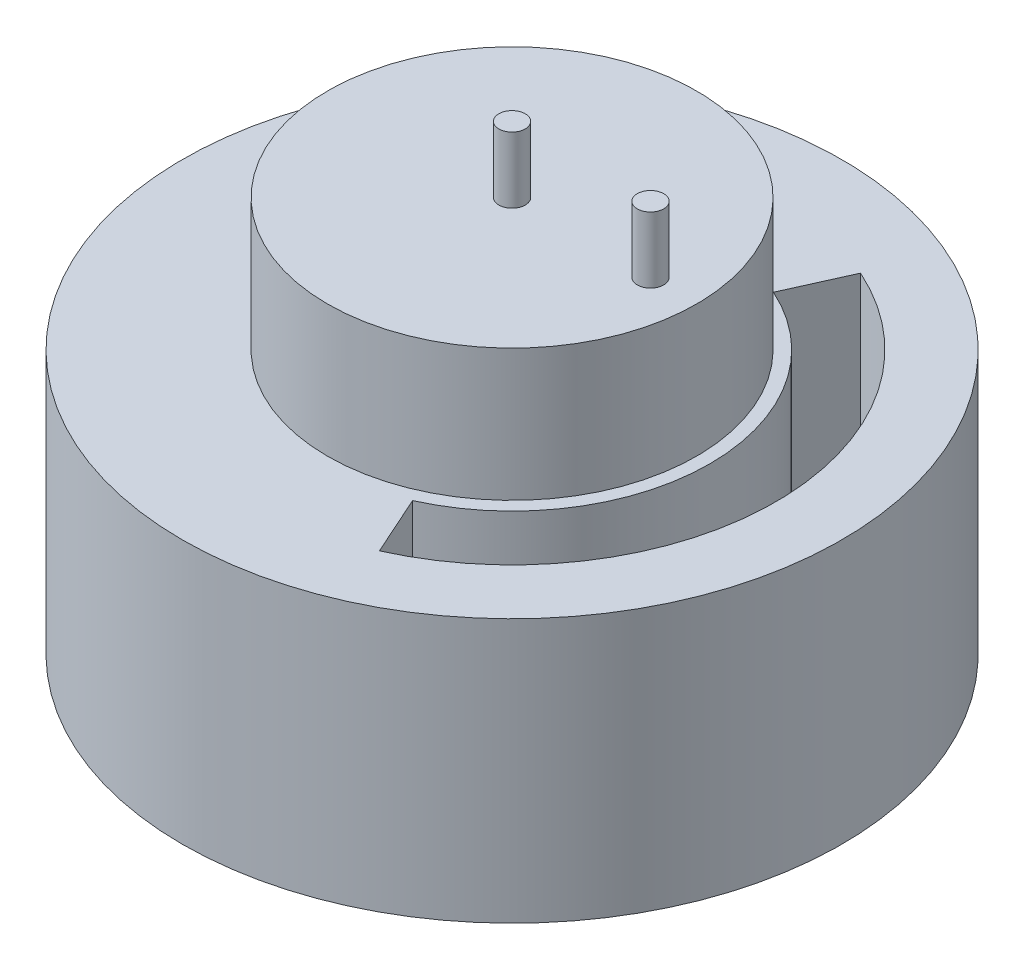
ISO-10303-21;
HEADER;
FILE_DESCRIPTION(('STEP AP214'),'2;1');
FILE_NAME('part.step','',(''),(''),'','','');
FILE_SCHEMA(('AUTOMOTIVE_DESIGN { 1 0 10303 214 1 1 1 1 }'));
ENDSEC;
DATA;
#1=APPLICATION_CONTEXT('core data for automotive mechanical design processes');
#2=APPLICATION_PROTOCOL_DEFINITION('international standard','automotive_design',2000,#1);
#3=PRODUCT_CONTEXT('',#1,'mechanical');
#4=PRODUCT('Part','Part','',(#3));
#5=PRODUCT_RELATED_PRODUCT_CATEGORY('part','',(#4));
#6=PRODUCT_DEFINITION_FORMATION('','',#4);
#7=PRODUCT_DEFINITION_CONTEXT('part definition',#1,'design');
#8=PRODUCT_DEFINITION('design','',#6,#7);
#9=PRODUCT_DEFINITION_SHAPE('','',#8);
#10=(LENGTH_UNIT() NAMED_UNIT(*) SI_UNIT(.MILLI.,.METRE.));
#11=(NAMED_UNIT(*) PLANE_ANGLE_UNIT() SI_UNIT($,.RADIAN.));
#12=(NAMED_UNIT(*) SI_UNIT($,.STERADIAN.) SOLID_ANGLE_UNIT());
#13=UNCERTAINTY_MEASURE_WITH_UNIT(LENGTH_MEASURE(1.E-05),#10,'distance_accuracy_value','');
#14=(GEOMETRIC_REPRESENTATION_CONTEXT(3) GLOBAL_UNCERTAINTY_ASSIGNED_CONTEXT((#13)) GLOBAL_UNIT_ASSIGNED_CONTEXT((#10,
#11,#12)) REPRESENTATION_CONTEXT('',''));
#15=CARTESIAN_POINT('',(0.,0.,0.));
#16=DIRECTION('',(0.,0.,1.));
#17=DIRECTION('',(1.,0.,0.));
#18=AXIS2_PLACEMENT_3D('',#15,#16,#17);
#19=CARTESIAN_POINT('',(0.,20.,0.));
#20=DIRECTION('',(0.,-1.,0.));
#21=DIRECTION('',(0.,0.,-1.));
#22=AXIS2_PLACEMENT_3D('',#19,#20,#21);
#23=CYLINDRICAL_SURFACE('',#22,25.);
#24=CARTESIAN_POINT('',(0.,20.,0.));
#25=DIRECTION('',(0.,1.,0.));
#26=DIRECTION('',(0.,0.,1.));
#27=AXIS2_PLACEMENT_3D('',#24,#25,#26);
#28=CIRCLE('',#27,25.);
#29=CARTESIAN_POINT('',(0.,20.,25.));
#30=VERTEX_POINT('',#29);
#31=EDGE_CURVE('E44',#30,#30,#28,.T.);
#32=ORIENTED_EDGE('',*,*,#31,.F.);
#33=EDGE_LOOP('',(#32));
#34=FACE_BOUND('',#33,.T.);
#35=CARTESIAN_POINT('',(0.,0.,0.));
#36=DIRECTION('',(0.,1.,0.));
#37=DIRECTION('',(0.,0.,1.));
#38=AXIS2_PLACEMENT_3D('',#35,#36,#37);
#39=CIRCLE('',#38,25.);
#40=CARTESIAN_POINT('',(0.,0.,25.));
#41=VERTEX_POINT('',#40);
#42=EDGE_CURVE('E39',#41,#41,#39,.T.);
#43=ORIENTED_EDGE('',*,*,#42,.T.);
#44=EDGE_LOOP('',(#43));
#45=FACE_BOUND('',#44,.T.);
#46=ADVANCED_FACE('F36',(#34,#45),#23,.T.);
#47=CARTESIAN_POINT('',(0.,20.,0.));
#48=DIRECTION('',(0.,1.,0.));
#49=DIRECTION('',(0.,0.,1.));
#50=AXIS2_PLACEMENT_3D('',#47,#48,#49);
#51=PLANE('',#50);
#52=CARTESIAN_POINT('',(0.,20.,0.));
#53=DIRECTION('',(0.,-1.,0.));
#54=DIRECTION('',(0.,0.,1.));
#55=AXIS2_PLACEMENT_3D('',#52,#53,#54);
#56=CIRCLE('',#55,15.);
#57=CARTESIAN_POINT('',(6.13929231044262,20.,-13.6860911120356));
#58=VERTEX_POINT('',#57);
#59=CARTESIAN_POINT('',(6.13929231044262,20.,13.6860911120356));
#60=VERTEX_POINT('',#59);
#61=EDGE_CURVE('E52',#58,#60,#56,.T.);
#62=ORIENTED_EDGE('',*,*,#61,.F.);
#63=DIRECTION('',(-0.409286154029508,0.,0.912406074135707));
#64=VECTOR('',#63,1.);
#65=CARTESIAN_POINT('',(8.18572308059016,20.,-18.2481214827141));
#66=LINE('',#65,#64);
#67=CARTESIAN_POINT('',(8.18572308059016,20.,-18.2481214827141));
#68=VERTEX_POINT('',#67);
#69=EDGE_CURVE('E97',#68,#58,#66,.T.);
#70=ORIENTED_EDGE('',*,*,#69,.F.);
#71=CARTESIAN_POINT('',(0.,20.,0.));
#72=DIRECTION('',(0.,1.,0.));
#73=DIRECTION('',(0.,0.,1.));
#74=AXIS2_PLACEMENT_3D('',#71,#72,#73);
#75=CIRCLE('',#74,20.);
#76=CARTESIAN_POINT('',(8.18572308059016,20.,18.2481214827141));
#77=VERTEX_POINT('',#76);
#78=EDGE_CURVE('E81',#77,#68,#75,.T.);
#79=ORIENTED_EDGE('',*,*,#78,.F.);
#80=DIRECTION('',(0.409286154029508,0.,0.912406074135707));
#81=VECTOR('',#80,1.);
#82=CARTESIAN_POINT('',(8.18572308059016,20.,18.2481214827141));
#83=LINE('',#82,#81);
#84=EDGE_CURVE('E90',#60,#77,#83,.T.);
#85=ORIENTED_EDGE('',*,*,#84,.F.);
#86=EDGE_LOOP('',(#62,#70,#79,#85));
#87=FACE_BOUND('',#86,.T.);
#88=CARTESIAN_POINT('',(0.,20.,0.));
#89=DIRECTION('',(0.,1.,0.));
#90=DIRECTION('',(0.,0.,1.));
#91=AXIS2_PLACEMENT_3D('',#88,#89,#90);
#92=CIRCLE('',#91,14.);
#93=CARTESIAN_POINT('',(0.,20.,14.));
#94=VERTEX_POINT('',#93);
#95=EDGE_CURVE('E11',#94,#94,#92,.T.);
#96=ORIENTED_EDGE('',*,*,#95,.F.);
#97=EDGE_LOOP('',(#96));
#98=FACE_BOUND('',#97,.T.);
#99=ORIENTED_EDGE('',*,*,#31,.T.);
#100=EDGE_LOOP('',(#99));
#101=FACE_BOUND('',#100,.T.);
#102=ADVANCED_FACE('F94',(#87,#98,#101),#51,.T.);
#103=CARTESIAN_POINT('',(0.,0.,0.));
#104=DIRECTION('',(0.,1.,0.));
#105=DIRECTION('',(0.,0.,1.));
#106=AXIS2_PLACEMENT_3D('',#103,#104,#105);
#107=PLANE('',#106);
#108=DIRECTION('',(0.409286154029508,0.,-0.912406074135707));
#109=VECTOR('',#108,1.);
#110=CARTESIAN_POINT('',(8.18572308059016,0.,-18.2481214827141));
#111=LINE('',#110,#109);
#112=CARTESIAN_POINT('',(6.13929231044262,0.,-13.6860911120356));
#113=VERTEX_POINT('',#112);
#114=CARTESIAN_POINT('',(8.18572308059016,0.,-18.2481214827141));
#115=VERTEX_POINT('',#114);
#116=EDGE_CURVE('E261',#113,#115,#111,.T.);
#117=ORIENTED_EDGE('',*,*,#116,.F.);
#118=CARTESIAN_POINT('',(0.,0.,0.));
#119=DIRECTION('',(0.,1.,0.));
#120=DIRECTION('',(0.,0.,1.));
#121=AXIS2_PLACEMENT_3D('',#118,#119,#120);
#122=CIRCLE('',#121,15.);
#123=CARTESIAN_POINT('',(6.13929231044262,0.,13.6860911120356));
#124=VERTEX_POINT('',#123);
#125=EDGE_CURVE('E109',#124,#113,#122,.T.);
#126=ORIENTED_EDGE('',*,*,#125,.F.);
#127=DIRECTION('',(-0.409286154029508,0.,-0.912406074135707));
#128=VECTOR('',#127,1.);
#129=CARTESIAN_POINT('',(8.18572308059016,0.,18.2481214827141));
#130=LINE('',#129,#128);
#131=CARTESIAN_POINT('',(8.18572308059017,0.,18.2481214827142));
#132=VERTEX_POINT('',#131);
#133=EDGE_CURVE('E106',#132,#124,#130,.T.);
#134=ORIENTED_EDGE('',*,*,#133,.F.);
#135=CARTESIAN_POINT('',(0.,0.,0.));
#136=DIRECTION('',(0.,1.,0.));
#137=DIRECTION('',(0.,0.,1.));
#138=AXIS2_PLACEMENT_3D('',#135,#136,#137);
#139=CIRCLE('',#138,20.);
#140=EDGE_CURVE('E84',#115,#132,#139,.F.);
#141=ORIENTED_EDGE('',*,*,#140,.F.);
#142=EDGE_LOOP('',(#117,#126,#134,#141));
#143=FACE_BOUND('',#142,.T.);
#144=ORIENTED_EDGE('',*,*,#42,.F.);
#145=EDGE_LOOP('',(#144));
#146=FACE_BOUND('',#145,.T.);
#147=ADVANCED_FACE('F130',(#143,#146),#107,.F.);
#148=CARTESIAN_POINT('',(0.,30.,0.));
#149=DIRECTION('',(0.,-1.,0.));
#150=DIRECTION('',(0.,0.,-1.));
#151=AXIS2_PLACEMENT_3D('',#148,#149,#150);
#152=CYLINDRICAL_SURFACE('',#151,14.);
#153=CARTESIAN_POINT('',(0.,30.,0.));
#154=DIRECTION('',(0.,1.,0.));
#155=DIRECTION('',(0.,0.,1.));
#156=AXIS2_PLACEMENT_3D('',#153,#154,#155);
#157=CIRCLE('',#156,14.);
#158=CARTESIAN_POINT('',(0.,30.,14.));
#159=VERTEX_POINT('',#158);
#160=EDGE_CURVE('E119',#159,#159,#157,.T.);
#161=ORIENTED_EDGE('',*,*,#160,.F.);
#162=EDGE_LOOP('',(#161));
#163=FACE_BOUND('',#162,.T.);
#164=ORIENTED_EDGE('',*,*,#95,.T.);
#165=EDGE_LOOP('',(#164));
#166=FACE_BOUND('',#165,.T.);
#167=ADVANCED_FACE('F132',(#163,#166),#152,.T.);
#168=CARTESIAN_POINT('',(0.,30.,0.));
#169=DIRECTION('',(0.,1.,0.));
#170=DIRECTION('',(0.,0.,1.));
#171=AXIS2_PLACEMENT_3D('',#168,#169,#170);
#172=PLANE('',#171);
#173=CARTESIAN_POINT('',(10.5,30.,0.));
#174=DIRECTION('',(0.,1.,0.));
#175=DIRECTION('',(0.,0.,1.));
#176=AXIS2_PLACEMENT_3D('',#173,#174,#175);
#177=CIRCLE('',#176,1.);
#178=CARTESIAN_POINT('',(10.5,30.,1.));
#179=VERTEX_POINT('',#178);
#180=EDGE_CURVE('E108',#179,#179,#177,.T.);
#181=ORIENTED_EDGE('',*,*,#180,.F.);
#182=EDGE_LOOP('',(#181));
#183=FACE_BOUND('',#182,.T.);
#184=CARTESIAN_POINT('',(0.,30.,0.));
#185=DIRECTION('',(0.,1.,0.));
#186=DIRECTION('',(0.,0.,1.));
#187=AXIS2_PLACEMENT_3D('',#184,#185,#186);
#188=CIRCLE('',#187,1.);
#189=CARTESIAN_POINT('',(0.,30.,1.));
#190=VERTEX_POINT('',#189);
#191=EDGE_CURVE('E113',#190,#190,#188,.T.);
#192=ORIENTED_EDGE('',*,*,#191,.F.);
#193=EDGE_LOOP('',(#192));
#194=FACE_BOUND('',#193,.T.);
#195=ORIENTED_EDGE('',*,*,#160,.T.);
#196=EDGE_LOOP('',(#195));
#197=FACE_BOUND('',#196,.T.);
#198=ADVANCED_FACE('F138',(#183,#194,#197),#172,.T.);
#199=CARTESIAN_POINT('',(0.,35.,0.));
#200=DIRECTION('',(0.,-1.,0.));
#201=DIRECTION('',(0.,0.,-1.));
#202=AXIS2_PLACEMENT_3D('',#199,#200,#201);
#203=CYLINDRICAL_SURFACE('',#202,1.);
#204=CARTESIAN_POINT('',(0.,35.,0.));
#205=DIRECTION('',(0.,1.,0.));
#206=DIRECTION('',(0.,0.,1.));
#207=AXIS2_PLACEMENT_3D('',#204,#205,#206);
#208=CIRCLE('',#207,1.);
#209=CARTESIAN_POINT('',(0.,35.,1.));
#210=VERTEX_POINT('',#209);
#211=EDGE_CURVE('E116',#210,#210,#208,.T.);
#212=ORIENTED_EDGE('',*,*,#211,.F.);
#213=EDGE_LOOP('',(#212));
#214=FACE_BOUND('',#213,.T.);
#215=ORIENTED_EDGE('',*,*,#191,.T.);
#216=EDGE_LOOP('',(#215));
#217=FACE_BOUND('',#216,.T.);
#218=ADVANCED_FACE('F212',(#214,#217),#203,.T.);
#219=CARTESIAN_POINT('',(0.,35.,0.));
#220=DIRECTION('',(0.,1.,0.));
#221=DIRECTION('',(0.,0.,1.));
#222=AXIS2_PLACEMENT_3D('',#219,#220,#221);
#223=PLANE('',#222);
#224=ORIENTED_EDGE('',*,*,#211,.T.);
#225=EDGE_LOOP('',(#224));
#226=FACE_BOUND('',#225,.T.);
#227=ADVANCED_FACE('F208',(#226),#223,.T.);
#228=CARTESIAN_POINT('',(10.5,35.,0.));
#229=DIRECTION('',(0.,-1.,0.));
#230=DIRECTION('',(0.,0.,-1.));
#231=AXIS2_PLACEMENT_3D('',#228,#229,#230);
#232=CYLINDRICAL_SURFACE('',#231,1.);
#233=CARTESIAN_POINT('',(10.5,35.,0.));
#234=DIRECTION('',(0.,1.,0.));
#235=DIRECTION('',(0.,0.,1.));
#236=AXIS2_PLACEMENT_3D('',#233,#234,#235);
#237=CIRCLE('',#236,1.);
#238=CARTESIAN_POINT('',(10.5,35.,1.));
#239=VERTEX_POINT('',#238);
#240=EDGE_CURVE('E110',#239,#239,#237,.T.);
#241=ORIENTED_EDGE('',*,*,#240,.F.);
#242=EDGE_LOOP('',(#241));
#243=FACE_BOUND('',#242,.T.);
#244=ORIENTED_EDGE('',*,*,#180,.T.);
#245=EDGE_LOOP('',(#244));
#246=FACE_BOUND('',#245,.T.);
#247=ADVANCED_FACE('F204',(#243,#246),#232,.T.);
#248=CARTESIAN_POINT('',(10.5,35.,0.));
#249=DIRECTION('',(0.,1.,0.));
#250=DIRECTION('',(0.,0.,1.));
#251=AXIS2_PLACEMENT_3D('',#248,#249,#250);
#252=PLANE('',#251);
#253=ORIENTED_EDGE('',*,*,#240,.T.);
#254=EDGE_LOOP('',(#253));
#255=FACE_BOUND('',#254,.T.);
#256=ADVANCED_FACE('F158',(#255),#252,.T.);
#257=CARTESIAN_POINT('',(0.,-39.0396589156069,0.));
#258=DIRECTION('',(0.,1.,0.));
#259=DIRECTION('',(0.,0.,1.));
#260=AXIS2_PLACEMENT_3D('',#257,#258,#259);
#261=CYLINDRICAL_SURFACE('',#260,15.);
#262=ORIENTED_EDGE('',*,*,#125,.T.);
#263=DIRECTION('',(0.,1.,0.));
#264=VECTOR('',#263,1.);
#265=CARTESIAN_POINT('',(6.13929231044262,-39.0396589156069,-13.6860911120356));
#266=LINE('',#265,#264);
#267=EDGE_CURVE('E102',#113,#58,#266,.T.);
#268=ORIENTED_EDGE('',*,*,#267,.T.);
#269=ORIENTED_EDGE('',*,*,#61,.T.);
#270=DIRECTION('',(0.,1.,0.));
#271=VECTOR('',#270,1.);
#272=CARTESIAN_POINT('',(6.13929231044262,-39.0396589156069,13.6860911120356));
#273=LINE('',#272,#271);
#274=EDGE_CURVE('E87',#124,#60,#273,.T.);
#275=ORIENTED_EDGE('',*,*,#274,.F.);
#276=EDGE_LOOP('',(#262,#268,#269,#275));
#277=FACE_BOUND('',#276,.T.);
#278=ADVANCED_FACE('F168',(#277),#261,.T.);
#279=CARTESIAN_POINT('',(8.18572308059016,-39.0396589156069,-18.2481214827141));
#280=DIRECTION('',(-0.912406074135707,0.,-0.409286154029508));
#281=DIRECTION('',(-0.409286154029508,0.,0.912406074135707));
#282=AXIS2_PLACEMENT_3D('',#279,#280,#281);
#283=PLANE('',#282);
#284=ORIENTED_EDGE('',*,*,#116,.T.);
#285=DIRECTION('',(0.,1.,0.));
#286=VECTOR('',#285,1.);
#287=CARTESIAN_POINT('',(8.18572308059016,-39.0396589156069,-18.2481214827141));
#288=LINE('',#287,#286);
#289=EDGE_CURVE('E86',#115,#68,#288,.T.);
#290=ORIENTED_EDGE('',*,*,#289,.T.);
#291=ORIENTED_EDGE('',*,*,#69,.T.);
#292=ORIENTED_EDGE('',*,*,#267,.F.);
#293=EDGE_LOOP('',(#284,#290,#291,#292));
#294=FACE_BOUND('',#293,.T.);
#295=ADVANCED_FACE('F173',(#294),#283,.F.);
#296=CARTESIAN_POINT('',(0.,-39.0396589156069,0.));
#297=DIRECTION('',(0.,1.,0.));
#298=DIRECTION('',(0.,0.,1.));
#299=AXIS2_PLACEMENT_3D('',#296,#297,#298);
#300=CYLINDRICAL_SURFACE('',#299,20.);
#301=ORIENTED_EDGE('',*,*,#140,.T.);
#302=DIRECTION('',(0.,1.,0.));
#303=VECTOR('',#302,1.);
#304=CARTESIAN_POINT('',(8.18572308059016,-39.0396589156069,18.2481214827141));
#305=LINE('',#304,#303);
#306=EDGE_CURVE('E60',#132,#77,#305,.T.);
#307=ORIENTED_EDGE('',*,*,#306,.T.);
#308=ORIENTED_EDGE('',*,*,#78,.T.);
#309=ORIENTED_EDGE('',*,*,#289,.F.);
#310=EDGE_LOOP('',(#301,#307,#308,#309));
#311=FACE_BOUND('',#310,.T.);
#312=ADVANCED_FACE('F78',(#311),#300,.F.);
#313=CARTESIAN_POINT('',(8.18572308059016,-39.0396589156069,18.2481214827141));
#314=DIRECTION('',(-0.912406074135707,0.,0.409286154029508));
#315=DIRECTION('',(0.409286154029508,0.,0.912406074135707));
#316=AXIS2_PLACEMENT_3D('',#313,#314,#315);
#317=PLANE('',#316);
#318=ORIENTED_EDGE('',*,*,#133,.T.);
#319=ORIENTED_EDGE('',*,*,#274,.T.);
#320=ORIENTED_EDGE('',*,*,#84,.T.);
#321=ORIENTED_EDGE('',*,*,#306,.F.);
#322=EDGE_LOOP('',(#318,#319,#320,#321));
#323=FACE_BOUND('',#322,.T.);
#324=ADVANCED_FACE('F91',(#323),#317,.F.);
#325=CLOSED_SHELL('',(#46,#102,#147,#167,#198,#218,#227,#247,#256,#278,#295,#312,#324));
#326=MANIFOLD_SOLID_BREP('B2',#325);
#327=ADVANCED_BREP_SHAPE_REPRESENTATION('',(#18,#326),#14);
#328=SHAPE_DEFINITION_REPRESENTATION(#9,#327);
ENDSEC;
END-ISO-10303-21;
